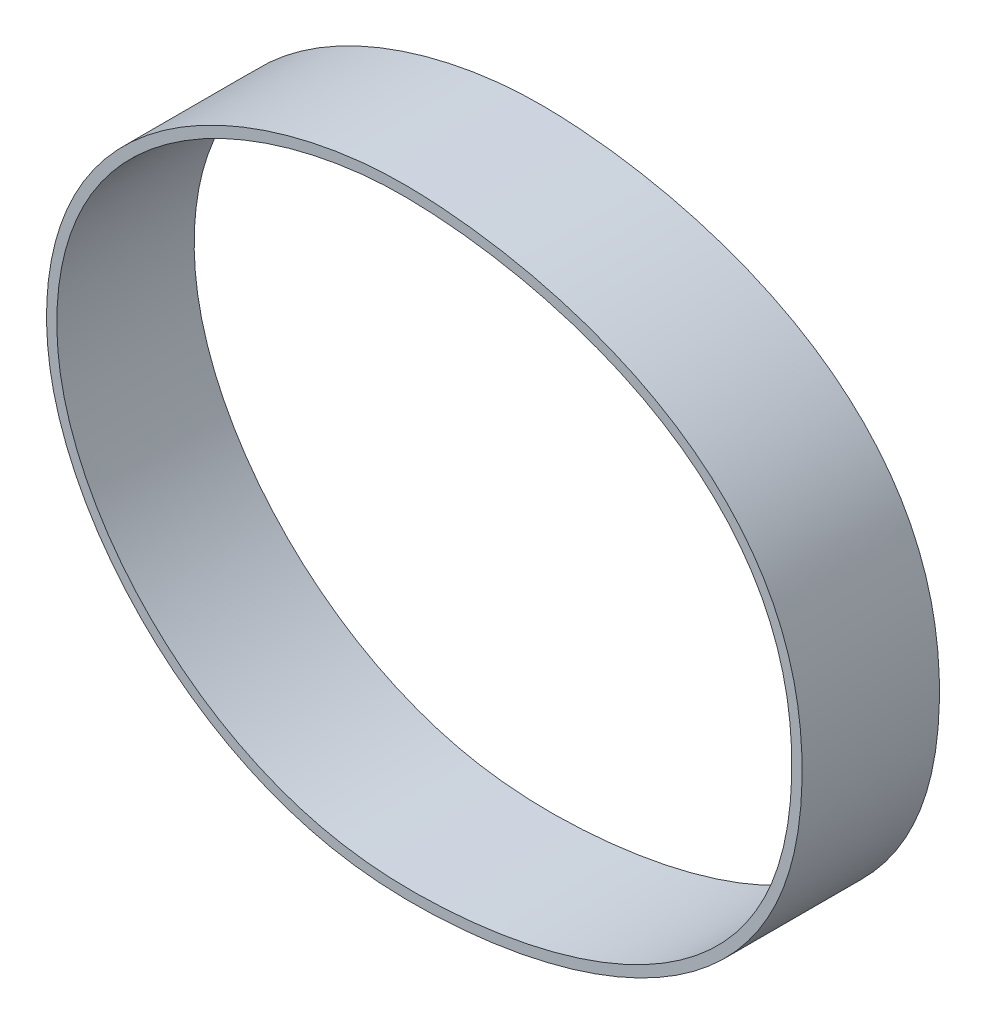
ISO-10303-21;
HEADER;
FILE_DESCRIPTION(('STEP AP214'),'2;1');
FILE_NAME('part.step','',(''),(''),'','','');
FILE_SCHEMA(('AUTOMOTIVE_DESIGN { 1 0 10303 214 1 1 1 1 }'));
ENDSEC;
DATA;
#1=APPLICATION_CONTEXT('core data for automotive mechanical design processes');
#2=APPLICATION_PROTOCOL_DEFINITION('international standard','automotive_design',2000,#1);
#3=PRODUCT_CONTEXT('',#1,'mechanical');
#4=PRODUCT('Part','Part','',(#3));
#5=PRODUCT_RELATED_PRODUCT_CATEGORY('part','',(#4));
#6=PRODUCT_DEFINITION_FORMATION('','',#4);
#7=PRODUCT_DEFINITION_CONTEXT('part definition',#1,'design');
#8=PRODUCT_DEFINITION('design','',#6,#7);
#9=PRODUCT_DEFINITION_SHAPE('','',#8);
#10=(LENGTH_UNIT() NAMED_UNIT(*) SI_UNIT(.MILLI.,.METRE.));
#11=(NAMED_UNIT(*) PLANE_ANGLE_UNIT() SI_UNIT($,.RADIAN.));
#12=(NAMED_UNIT(*) SI_UNIT($,.STERADIAN.) SOLID_ANGLE_UNIT());
#13=UNCERTAINTY_MEASURE_WITH_UNIT(LENGTH_MEASURE(1.E-05),#10,'distance_accuracy_value','');
#14=(GEOMETRIC_REPRESENTATION_CONTEXT(3) GLOBAL_UNCERTAINTY_ASSIGNED_CONTEXT((#13)) GLOBAL_UNIT_ASSIGNED_CONTEXT((#10,
#11,#12)) REPRESENTATION_CONTEXT('',''));
#15=CARTESIAN_POINT('',(0.,0.,0.));
#16=DIRECTION('',(0.,0.,1.));
#17=DIRECTION('',(1.,0.,0.));
#18=AXIS2_PLACEMENT_3D('',#15,#16,#17);
#19=CARTESIAN_POINT('',(-46.9016961364812,-65.6863327263849,40.));
#20=DIRECTION('',(0.,0.,1.));
#21=DIRECTION('',(1.,0.,0.));
#22=AXIS2_PLACEMENT_3D('',#19,#20,#21);
#23=PLANE('',#22);
#24=CARTESIAN_POINT('',(-3.38486562515244,105.462412162452,40.));
#25=CARTESIAN_POINT('',(-8.87341714329914,105.508261082398,40.));
#26=CARTESIAN_POINT('',(-51.3166081497218,102.978717261109,40.));
#27=CARTESIAN_POINT('',(-108.495750998458,73.1068116943512,40.));
#28=CARTESIAN_POINT('',(-109.21693042046,-20.6273070867448,40.));
#29=CARTESIAN_POINT('',(-58.9725234842519,-73.3317341190809,40.));
#30=CARTESIAN_POINT('',(38.9275588605866,-76.1576465679928,40.));
#31=CARTESIAN_POINT('',(110.91100532639,-48.4115198971415,40.));
#32=CARTESIAN_POINT('',(113.86571657815,88.3268849727158,40.));
#33=CARTESIAN_POINT('',(32.0399779293067,105.166488764293,40.));
#34=CARTESIAN_POINT('',(-3.38486562515244,105.462412162452,40.));
#35=B_SPLINE_CURVE_WITH_KNOTS('',3,(#24,#25,#26,#27,#28,#29,#30,#31,#32,#33,#34),.UNSPECIFIED.,
.T.,.F.,(4,1,1,1,1,1,1,1,4),(0.,0.0324478270798018,0.292030443718215,0.348002137427023,
0.536193070459067,0.580475408297526,0.746543177973155,0.790571484264348,0.999999999999999),.UNSPECIFIED.);
#36=CARTESIAN_POINT('',(-3.38486562515244,105.462412162452,40.));
#37=VERTEX_POINT('',#36);
#38=EDGE_CURVE('E10',#37,#37,#35,.T.);
#39=ORIENTED_EDGE('',*,*,#38,.T.);
#40=EDGE_LOOP('',(#39));
#41=FACE_BOUND('',#40,.T.);
#42=CARTESIAN_POINT('',(-3.40992541743046,102.462516829809,40.));
#43=CARTESIAN_POINT('',(-8.57780536480645,102.506360246963,40.));
#44=CARTESIAN_POINT('',(-17.4430597594847,102.001100291056,40.));
#45=CARTESIAN_POINT('',(-31.1310569094435,99.7219978161696,40.));
#46=CARTESIAN_POINT('',(-44.8065515583407,95.8961279310648,40.));
#47=CARTESIAN_POINT('',(-58.0423506201122,90.4935775568937,40.));
#48=CARTESIAN_POINT('',(-70.4248700687345,83.4939674180673,40.));
#49=CARTESIAN_POINT('',(-81.5481629762755,74.8813968441738,40.));
#50=CARTESIAN_POINT('',(-91.0229893159546,64.6408057335145,40.));
#51=CARTESIAN_POINT('',(-98.4812000492251,52.7402255516616,40.));
#52=CARTESIAN_POINT('',(-102.716242780293,41.3928138280394,40.));
#53=CARTESIAN_POINT('',(-104.731049525556,31.3920634123813,40.));
#54=CARTESIAN_POINT('',(-105.747121492033,20.813521412282,40.));
#55=CARTESIAN_POINT('',(-104.946480119786,6.91346617864385,40.));
#56=CARTESIAN_POINT('',(-99.9668227356528,-9.81748672387147,40.));
#57=CARTESIAN_POINT('',(-91.1808478794557,-25.9873099884355,40.));
#58=CARTESIAN_POINT('',(-79.0036335421212,-40.8120076180558,40.));
#59=CARTESIAN_POINT('',(-63.8298592364817,-53.5642940975708,40.));
#60=CARTESIAN_POINT('',(-46.065679366011,-63.5152962275632,40.));
#61=CARTESIAN_POINT('',(-26.1335802007215,-69.9882797787909,40.));
#62=CARTESIAN_POINT('',(-7.96918738623433,-71.8319121848551,40.));
#63=CARTESIAN_POINT('',(7.35029412808775,-71.4628835375593,40.));
#64=CARTESIAN_POINT('',(23.0686024732722,-70.0269286039475,40.));
#65=CARTESIAN_POINT('',(42.8884866614053,-66.1154362153266,40.));
#66=CARTESIAN_POINT('',(65.2753996511676,-57.5430425433126,40.));
#67=CARTESIAN_POINT('',(84.6103548833095,-44.6670292766313,40.));
#68=CARTESIAN_POINT('',(96.9061995000579,-30.0012824912603,40.));
#69=CARTESIAN_POINT('',(103.760045228271,-15.6146288314265,40.));
#70=CARTESIAN_POINT('',(107.213174843227,-3.35714605629228,40.));
#71=CARTESIAN_POINT('',(108.819124058452,10.339744138612,40.));
#72=CARTESIAN_POINT('',(108.605810884795,21.9213010497017,40.));
#73=CARTESIAN_POINT('',(107.511695360321,30.7339842835629,40.));
#74=CARTESIAN_POINT('',(105.808979128047,39.039981683889,40.));
#75=CARTESIAN_POINT('',(102.595385453384,48.5028352004795,40.));
#76=CARTESIAN_POINT('',(97.2209551290924,58.5070906984465,40.));
#77=CARTESIAN_POINT('',(88.291890894884,70.1859296314296,40.));
#78=CARTESIAN_POINT('',(74.2982013068666,81.8986033091276,40.));
#79=CARTESIAN_POINT('',(54.5960836989776,91.883847415271,40.));
#80=CARTESIAN_POINT('',(33.7459264926602,98.3098397603502,40.));
#81=CARTESIAN_POINT('',(13.5642199247712,101.738039788134,40.));
#82=CARTESIAN_POINT('',(1.75795452994553,102.418673412656,40.));
#83=CARTESIAN_POINT('',(-3.40992541743046,102.462516829809,40.));
#84=B_SPLINE_CURVE_WITH_KNOTS('',3,(#42,#43,#44,#45,#46,#47,#48,#49,#50,#51,#52,#53,#54,#55,#56,
#57,#58,#59,#60,#61,#62,#63,#64,#65,#66,#67,#68,#69,#70,#71,#72,#73,#74,#75,#76,#77,#78,#79,#80,
#81,#82,#83),.UNSPECIFIED.,.T.,.F.,(4,1,1,1,1,1,1,1,1,1,1,1,1,1,1,1,1,1,1,1,1,1,1,1,1,1,1,1,1,1,
1,1,1,1,1,1,1,1,1,4),(0.,0.0312499999999999,0.0624999999999999,0.0937499999999999,0.125,0.15625,
0.1875,0.21875,0.25,0.28125,0.296875,0.3125,0.34375,0.375,0.40625,0.4375,0.46875,0.5,0.53125,
0.5625,0.578125,0.59375,0.625,0.65625,0.6875,0.71875,0.734375,0.75,0.765625,0.78125,0.7890625,
0.796875,0.8125,0.828125,0.84375,0.875,0.90625,0.937499999999999,0.968749999999999,
0.999999999999999),.UNSPECIFIED.);
#85=CARTESIAN_POINT('',(-3.40992541743046,102.462516829809,40.));
#86=VERTEX_POINT('',#85);
#87=EDGE_CURVE('E56',#86,#86,#84,.T.);
#88=ORIENTED_EDGE('',*,*,#87,.F.);
#89=EDGE_LOOP('',(#88));
#90=FACE_BOUND('',#89,.T.);
#91=ADVANCED_FACE('F41',(#41,#90),#23,.T.);
#92=CARTESIAN_POINT('',(-46.9016961364812,-65.6863327263849,0.));
#93=DIRECTION('',(0.,0.,1.));
#94=DIRECTION('',(1.,0.,0.));
#95=AXIS2_PLACEMENT_3D('',#92,#93,#94);
#96=PLANE('',#95);
#97=CARTESIAN_POINT('',(-3.38486562515244,105.462412162452,0.));
#98=CARTESIAN_POINT('',(-8.87341714329914,105.508261082398,0.));
#99=CARTESIAN_POINT('',(-51.3166081497218,102.978717261109,0.));
#100=CARTESIAN_POINT('',(-108.495750998458,73.1068116943512,0.));
#101=CARTESIAN_POINT('',(-109.21693042046,-20.6273070867448,0.));
#102=CARTESIAN_POINT('',(-58.9725234842519,-73.3317341190809,0.));
#103=CARTESIAN_POINT('',(38.9275588605866,-76.1576465679928,0.));
#104=CARTESIAN_POINT('',(110.91100532639,-48.4115198971415,0.));
#105=CARTESIAN_POINT('',(113.86571657815,88.3268849727158,0.));
#106=CARTESIAN_POINT('',(32.0399779293067,105.166488764293,0.));
#107=CARTESIAN_POINT('',(-3.38486562515244,105.462412162452,0.));
#108=B_SPLINE_CURVE_WITH_KNOTS('',3,(#97,#98,#99,#100,#101,#102,#103,#104,#105,#106,#107),
.UNSPECIFIED.,.T.,.F.,(4,1,1,1,1,1,1,1,4),(0.,0.0324478270798018,0.292030443718215,
0.348002137427023,0.536193070459067,0.580475408297526,0.746543177973155,0.790571484264348,
0.999999999999999),.UNSPECIFIED.);
#109=CARTESIAN_POINT('',(-3.38486562515244,105.462412162452,0.));
#110=VERTEX_POINT('',#109);
#111=EDGE_CURVE('E46',#110,#110,#108,.T.);
#112=ORIENTED_EDGE('',*,*,#111,.F.);
#113=EDGE_LOOP('',(#112));
#114=FACE_BOUND('',#113,.T.);
#115=CARTESIAN_POINT('',(-3.40992541743046,102.462516829809,0.));
#116=CARTESIAN_POINT('',(-8.57780536480645,102.506360246963,0.));
#117=CARTESIAN_POINT('',(-17.4430597594847,102.001100291056,0.));
#118=CARTESIAN_POINT('',(-31.1310569094435,99.7219978161696,0.));
#119=CARTESIAN_POINT('',(-44.8065515583407,95.8961279310648,0.));
#120=CARTESIAN_POINT('',(-58.0423506201122,90.4935775568937,0.));
#121=CARTESIAN_POINT('',(-70.4248700687345,83.4939674180673,0.));
#122=CARTESIAN_POINT('',(-81.5481629762755,74.8813968441738,0.));
#123=CARTESIAN_POINT('',(-91.0229893159546,64.6408057335145,0.));
#124=CARTESIAN_POINT('',(-98.4812000492251,52.7402255516616,0.));
#125=CARTESIAN_POINT('',(-102.716242780293,41.3928138280394,0.));
#126=CARTESIAN_POINT('',(-104.731049525556,31.3920634123813,0.));
#127=CARTESIAN_POINT('',(-105.747121492033,20.813521412282,0.));
#128=CARTESIAN_POINT('',(-104.946480119786,6.91346617864385,0.));
#129=CARTESIAN_POINT('',(-99.9668227356528,-9.81748672387147,0.));
#130=CARTESIAN_POINT('',(-91.1808478794557,-25.9873099884355,0.));
#131=CARTESIAN_POINT('',(-79.0036335421212,-40.8120076180558,0.));
#132=CARTESIAN_POINT('',(-63.8298592364817,-53.5642940975708,0.));
#133=CARTESIAN_POINT('',(-46.065679366011,-63.5152962275632,0.));
#134=CARTESIAN_POINT('',(-26.1335802007215,-69.9882797787909,0.));
#135=CARTESIAN_POINT('',(-7.96918738623433,-71.8319121848551,0.));
#136=CARTESIAN_POINT('',(7.35029412808775,-71.4628835375593,0.));
#137=CARTESIAN_POINT('',(23.0686024732722,-70.0269286039475,0.));
#138=CARTESIAN_POINT('',(42.8884866614053,-66.1154362153266,0.));
#139=CARTESIAN_POINT('',(65.2753996511676,-57.5430425433126,0.));
#140=CARTESIAN_POINT('',(84.6103548833095,-44.6670292766313,0.));
#141=CARTESIAN_POINT('',(96.9061995000579,-30.0012824912603,0.));
#142=CARTESIAN_POINT('',(103.760045228271,-15.6146288314265,0.));
#143=CARTESIAN_POINT('',(107.213174843227,-3.35714605629228,0.));
#144=CARTESIAN_POINT('',(108.819124058452,10.339744138612,0.));
#145=CARTESIAN_POINT('',(108.605810884795,21.9213010497017,0.));
#146=CARTESIAN_POINT('',(107.511695360321,30.7339842835629,0.));
#147=CARTESIAN_POINT('',(105.808979128047,39.039981683889,0.));
#148=CARTESIAN_POINT('',(102.595385453384,48.5028352004795,0.));
#149=CARTESIAN_POINT('',(97.2209551290924,58.5070906984465,0.));
#150=CARTESIAN_POINT('',(88.291890894884,70.1859296314296,0.));
#151=CARTESIAN_POINT('',(74.2982013068666,81.8986033091276,0.));
#152=CARTESIAN_POINT('',(54.5960836989776,91.883847415271,0.));
#153=CARTESIAN_POINT('',(33.7459264926602,98.3098397603502,0.));
#154=CARTESIAN_POINT('',(13.5642199247712,101.738039788134,0.));
#155=CARTESIAN_POINT('',(1.75795452994553,102.418673412656,0.));
#156=CARTESIAN_POINT('',(-3.40992541743046,102.462516829809,0.));
#157=B_SPLINE_CURVE_WITH_KNOTS('',3,(#115,#116,#117,#118,#119,#120,#121,#122,#123,#124,#125,
#126,#127,#128,#129,#130,#131,#132,#133,#134,#135,#136,#137,#138,#139,#140,#141,#142,#143,#144,
#145,#146,#147,#148,#149,#150,#151,#152,#153,#154,#155,#156),.UNSPECIFIED.,.T.,.F.,(4,1,1,1,1,1,
1,1,1,1,1,1,1,1,1,1,1,1,1,1,1,1,1,1,1,1,1,1,1,1,1,1,1,1,1,1,1,1,1,4),(0.,0.0312499999999999,
0.0624999999999999,0.0937499999999999,0.125,0.15625,0.1875,0.21875,0.25,0.28125,0.296875,0.3125,
0.34375,0.375,0.40625,0.4375,0.46875,0.5,0.53125,0.5625,0.578125,0.59375,0.625,0.65625,0.6875,
0.71875,0.734375,0.75,0.765625,0.78125,0.7890625,0.796875,0.8125,0.828125,0.84375,0.875,0.90625,
0.937499999999999,0.968749999999999,0.999999999999999),.UNSPECIFIED.);
#158=CARTESIAN_POINT('',(-3.40992541743046,102.462516829809,0.));
#159=VERTEX_POINT('',#158);
#160=EDGE_CURVE('E61',#159,#159,#157,.T.);
#161=ORIENTED_EDGE('',*,*,#160,.T.);
#162=EDGE_LOOP('',(#161));
#163=FACE_BOUND('',#162,.T.);
#164=ADVANCED_FACE('F87',(#114,#163),#96,.F.);
#165=DIRECTION('',(0.,0.,-1.));
#166=VECTOR('',#165,1.);
#167=SURFACE_OF_LINEAR_EXTRUSION('',#35,#166);
#168=ORIENTED_EDGE('',*,*,#38,.F.);
#169=EDGE_LOOP('',(#168));
#170=FACE_BOUND('',#169,.T.);
#171=ORIENTED_EDGE('',*,*,#111,.T.);
#172=EDGE_LOOP('',(#171));
#173=FACE_BOUND('',#172,.T.);
#174=ADVANCED_FACE('F43',(#170,#173),#167,.F.);
#175=DIRECTION('',(0.,0.,-1.));
#176=VECTOR('',#175,1.);
#177=SURFACE_OF_LINEAR_EXTRUSION('',#84,#176);
#178=ORIENTED_EDGE('',*,*,#87,.T.);
#179=EDGE_LOOP('',(#178));
#180=FACE_BOUND('',#179,.T.);
#181=ORIENTED_EDGE('',*,*,#160,.F.);
#182=EDGE_LOOP('',(#181));
#183=FACE_BOUND('',#182,.T.);
#184=ADVANCED_FACE('F82',(#180,#183),#177,.T.);
#185=CLOSED_SHELL('',(#91,#164,#174,#184));
#186=MANIFOLD_SOLID_BREP('B2',#185);
#187=ADVANCED_BREP_SHAPE_REPRESENTATION('',(#18,#186),#14);
#188=SHAPE_DEFINITION_REPRESENTATION(#9,#187);
ENDSEC;
END-ISO-10303-21;
